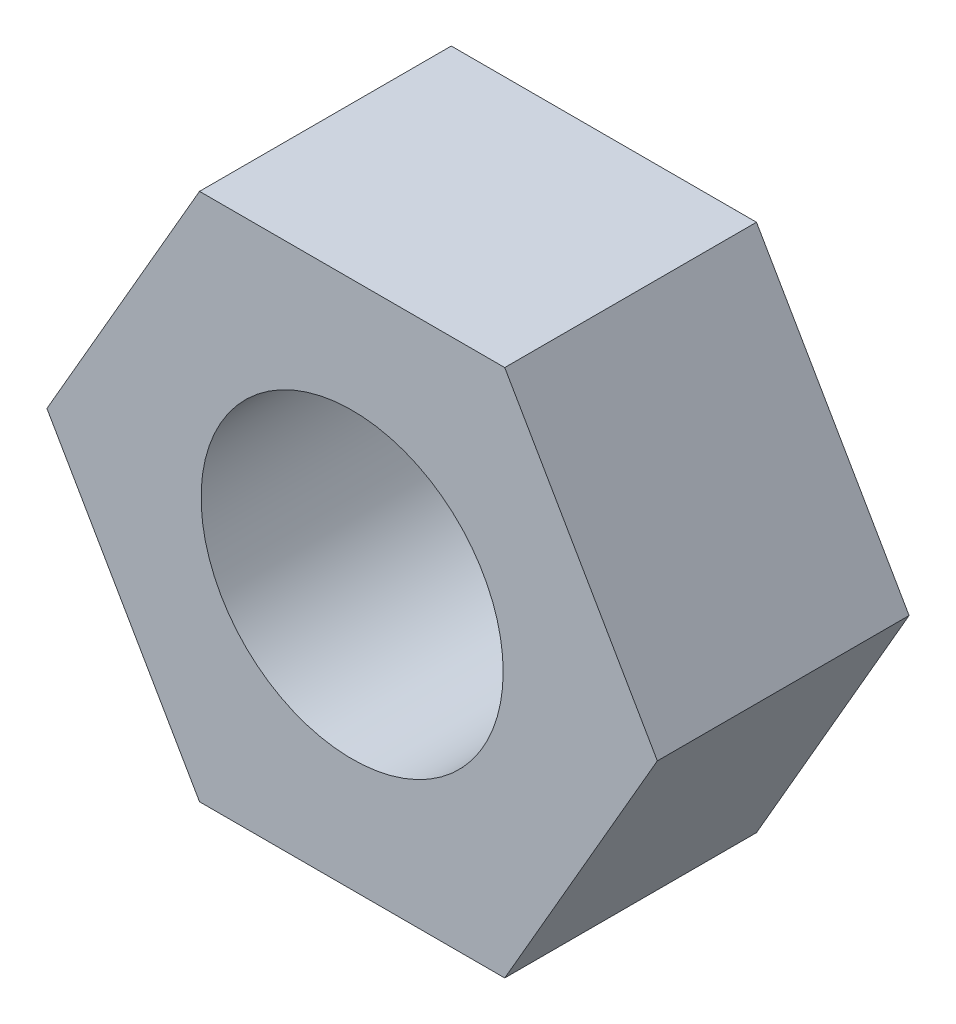
ISO-10303-21;
HEADER;
FILE_DESCRIPTION(('STEP AP214'),'2;1');
FILE_NAME('part.step','',(''),(''),'','','');
FILE_SCHEMA(('AUTOMOTIVE_DESIGN { 1 0 10303 214 1 1 1 1 }'));
ENDSEC;
DATA;
#1=APPLICATION_CONTEXT('core data for automotive mechanical design processes');
#2=APPLICATION_PROTOCOL_DEFINITION('international standard','automotive_design',2000,#1);
#3=PRODUCT_CONTEXT('',#1,'mechanical');
#4=PRODUCT('Part','Part','',(#3));
#5=PRODUCT_RELATED_PRODUCT_CATEGORY('part','',(#4));
#6=PRODUCT_DEFINITION_FORMATION('','',#4);
#7=PRODUCT_DEFINITION_CONTEXT('part definition',#1,'design');
#8=PRODUCT_DEFINITION('design','',#6,#7);
#9=PRODUCT_DEFINITION_SHAPE('','',#8);
#10=(LENGTH_UNIT() NAMED_UNIT(*) SI_UNIT(.MILLI.,.METRE.));
#11=(NAMED_UNIT(*) PLANE_ANGLE_UNIT() SI_UNIT($,.RADIAN.));
#12=(NAMED_UNIT(*) SI_UNIT($,.STERADIAN.) SOLID_ANGLE_UNIT());
#13=UNCERTAINTY_MEASURE_WITH_UNIT(LENGTH_MEASURE(1.E-05),#10,'distance_accuracy_value','');
#14=(GEOMETRIC_REPRESENTATION_CONTEXT(3) GLOBAL_UNCERTAINTY_ASSIGNED_CONTEXT((#13)) GLOBAL_UNIT_ASSIGNED_CONTEXT((#10,
#11,#12)) REPRESENTATION_CONTEXT('',''));
#15=CARTESIAN_POINT('',(0.,0.,0.));
#16=DIRECTION('',(0.,0.,1.));
#17=DIRECTION('',(1.,0.,0.));
#18=AXIS2_PLACEMENT_3D('',#15,#16,#17);
#19=CARTESIAN_POINT('',(0.,0.,5.));
#20=DIRECTION('',(0.,0.,1.));
#21=DIRECTION('',(1.,0.,0.));
#22=AXIS2_PLACEMENT_3D('',#19,#20,#21);
#23=PLANE('',#22);
#24=DIRECTION('',(0.5,0.866025403784439,0.));
#25=VECTOR('',#24,1.);
#26=CARTESIAN_POINT('',(3.03108891324554,-5.25000000000001,5.));
#27=LINE('',#26,#25);
#28=CARTESIAN_POINT('',(3.03108891324554,-5.25000000000001,5.));
#29=VERTEX_POINT('',#28);
#30=CARTESIAN_POINT('',(6.06217782649107,0.,5.));
#31=VERTEX_POINT('',#30);
#32=EDGE_CURVE('E128',#29,#31,#27,.T.);
#33=ORIENTED_EDGE('',*,*,#32,.T.);
#34=DIRECTION('',(-0.5,0.866025403784438,0.));
#35=VECTOR('',#34,1.);
#36=CARTESIAN_POINT('',(6.06217782649107,0.,5.));
#37=LINE('',#36,#35);
#38=CARTESIAN_POINT('',(3.03108891324553,5.25,5.));
#39=VERTEX_POINT('',#38);
#40=EDGE_CURVE('E86',#31,#39,#37,.T.);
#41=ORIENTED_EDGE('',*,*,#40,.T.);
#42=DIRECTION('',(-1.,0.,0.));
#43=VECTOR('',#42,1.);
#44=CARTESIAN_POINT('',(3.03108891324553,5.25,5.));
#45=LINE('',#44,#43);
#46=CARTESIAN_POINT('',(-3.03108891324553,5.25,5.));
#47=VERTEX_POINT('',#46);
#48=EDGE_CURVE('E99',#39,#47,#45,.T.);
#49=ORIENTED_EDGE('',*,*,#48,.T.);
#50=DIRECTION('',(-0.5,-0.866025403784439,0.));
#51=VECTOR('',#50,1.);
#52=CARTESIAN_POINT('',(-3.03108891324553,5.25,5.));
#53=LINE('',#52,#51);
#54=CARTESIAN_POINT('',(-6.06217782649107,0.,5.));
#55=VERTEX_POINT('',#54);
#56=EDGE_CURVE('E93',#47,#55,#53,.T.);
#57=ORIENTED_EDGE('',*,*,#56,.T.);
#58=DIRECTION('',(0.5,-0.866025403784439,0.));
#59=VECTOR('',#58,1.);
#60=CARTESIAN_POINT('',(-6.06217782649107,0.,5.));
#61=LINE('',#60,#59);
#62=CARTESIAN_POINT('',(-3.03108891324553,-5.25000000000001,5.));
#63=VERTEX_POINT('',#62);
#64=EDGE_CURVE('E97',#55,#63,#61,.T.);
#65=ORIENTED_EDGE('',*,*,#64,.T.);
#66=DIRECTION('',(1.,0.,0.));
#67=VECTOR('',#66,1.);
#68=CARTESIAN_POINT('',(-3.03108891324553,-5.25000000000001,5.));
#69=LINE('',#68,#67);
#70=EDGE_CURVE('E49',#63,#29,#69,.T.);
#71=ORIENTED_EDGE('',*,*,#70,.T.);
#72=EDGE_LOOP('',(#33,#41,#49,#57,#65,#71));
#73=FACE_BOUND('',#72,.T.);
#74=CARTESIAN_POINT('',(0.,0.,5.));
#75=DIRECTION('',(0.,0.,1.));
#76=DIRECTION('',(1.,0.,0.));
#77=AXIS2_PLACEMENT_3D('',#74,#75,#76);
#78=CIRCLE('',#77,3.);
#79=CARTESIAN_POINT('',(3.,0.,5.));
#80=VERTEX_POINT('',#79);
#81=EDGE_CURVE('E121',#80,#80,#78,.T.);
#82=ORIENTED_EDGE('',*,*,#81,.F.);
#83=EDGE_LOOP('',(#82));
#84=FACE_BOUND('',#83,.T.);
#85=ADVANCED_FACE('F32',(#73,#84),#23,.T.);
#86=CARTESIAN_POINT('',(0.,0.,0.));
#87=DIRECTION('',(0.,0.,1.));
#88=DIRECTION('',(1.,0.,0.));
#89=AXIS2_PLACEMENT_3D('',#86,#87,#88);
#90=PLANE('',#89);
#91=DIRECTION('',(0.5,0.866025403784439,0.));
#92=VECTOR('',#91,1.);
#93=CARTESIAN_POINT('',(3.03108891324554,-5.25000000000001,0.));
#94=LINE('',#93,#92);
#95=CARTESIAN_POINT('',(3.03108891324554,-5.25000000000001,0.));
#96=VERTEX_POINT('',#95);
#97=CARTESIAN_POINT('',(6.06217782649107,0.,0.));
#98=VERTEX_POINT('',#97);
#99=EDGE_CURVE('E117',#96,#98,#94,.T.);
#100=ORIENTED_EDGE('',*,*,#99,.F.);
#101=DIRECTION('',(1.,0.,0.));
#102=VECTOR('',#101,1.);
#103=CARTESIAN_POINT('',(-3.03108891324553,-5.25000000000001,0.));
#104=LINE('',#103,#102);
#105=CARTESIAN_POINT('',(-3.03108891324553,-5.25000000000001,0.));
#106=VERTEX_POINT('',#105);
#107=EDGE_CURVE('E78',#106,#96,#104,.T.);
#108=ORIENTED_EDGE('',*,*,#107,.F.);
#109=DIRECTION('',(0.5,-0.866025403784439,0.));
#110=VECTOR('',#109,1.);
#111=CARTESIAN_POINT('',(-6.06217782649107,0.,0.));
#112=LINE('',#111,#110);
#113=CARTESIAN_POINT('',(-6.06217782649107,0.,0.));
#114=VERTEX_POINT('',#113);
#115=EDGE_CURVE('E72',#114,#106,#112,.T.);
#116=ORIENTED_EDGE('',*,*,#115,.F.);
#117=DIRECTION('',(-0.5,-0.866025403784439,0.));
#118=VECTOR('',#117,1.);
#119=CARTESIAN_POINT('',(-3.03108891324553,5.25,0.));
#120=LINE('',#119,#118);
#121=CARTESIAN_POINT('',(-3.03108891324553,5.25,0.));
#122=VERTEX_POINT('',#121);
#123=EDGE_CURVE('E107',#122,#114,#120,.T.);
#124=ORIENTED_EDGE('',*,*,#123,.F.);
#125=DIRECTION('',(-1.,0.,0.));
#126=VECTOR('',#125,1.);
#127=CARTESIAN_POINT('',(3.03108891324553,5.25,0.));
#128=LINE('',#127,#126);
#129=CARTESIAN_POINT('',(3.03108891324553,5.25,0.));
#130=VERTEX_POINT('',#129);
#131=EDGE_CURVE('E123',#130,#122,#128,.T.);
#132=ORIENTED_EDGE('',*,*,#131,.F.);
#133=DIRECTION('',(-0.5,0.866025403784438,0.));
#134=VECTOR('',#133,1.);
#135=CARTESIAN_POINT('',(6.06217782649107,0.,0.));
#136=LINE('',#135,#134);
#137=EDGE_CURVE('E120',#98,#130,#136,.T.);
#138=ORIENTED_EDGE('',*,*,#137,.F.);
#139=EDGE_LOOP('',(#100,#108,#116,#124,#132,#138));
#140=FACE_BOUND('',#139,.T.);
#141=CARTESIAN_POINT('',(0.,0.,0.));
#142=DIRECTION('',(0.,0.,1.));
#143=DIRECTION('',(1.,0.,0.));
#144=AXIS2_PLACEMENT_3D('',#141,#142,#143);
#145=CIRCLE('',#144,3.);
#146=CARTESIAN_POINT('',(3.,0.,0.));
#147=VERTEX_POINT('',#146);
#148=EDGE_CURVE('E221',#147,#147,#145,.T.);
#149=ORIENTED_EDGE('',*,*,#148,.T.);
#150=EDGE_LOOP('',(#149));
#151=FACE_BOUND('',#150,.T.);
#152=ADVANCED_FACE('F137',(#140,#151),#90,.F.);
#153=CARTESIAN_POINT('',(3.03108891324554,-5.25000000000001,5.));
#154=DIRECTION('',(-0.866025403784439,0.5,0.));
#155=DIRECTION('',(-0.5,-0.866025403784439,0.));
#156=AXIS2_PLACEMENT_3D('',#153,#154,#155);
#157=PLANE('',#156);
#158=ORIENTED_EDGE('',*,*,#99,.T.);
#159=DIRECTION('',(0.,0.,-1.));
#160=VECTOR('',#159,1.);
#161=CARTESIAN_POINT('',(6.06217782649107,0.,5.));
#162=LINE('',#161,#160);
#163=EDGE_CURVE('E11',#31,#98,#162,.T.);
#164=ORIENTED_EDGE('',*,*,#163,.F.);
#165=ORIENTED_EDGE('',*,*,#32,.F.);
#166=DIRECTION('',(0.,0.,-1.));
#167=VECTOR('',#166,1.);
#168=CARTESIAN_POINT('',(3.03108891324554,-5.25000000000001,5.));
#169=LINE('',#168,#167);
#170=EDGE_CURVE('E113',#29,#96,#169,.T.);
#171=ORIENTED_EDGE('',*,*,#170,.T.);
#172=EDGE_LOOP('',(#158,#164,#165,#171));
#173=FACE_BOUND('',#172,.T.);
#174=ADVANCED_FACE('F34',(#173),#157,.F.);
#175=CARTESIAN_POINT('',(6.06217782649107,0.,5.));
#176=DIRECTION('',(-0.866025403784438,-0.5,0.));
#177=DIRECTION('',(0.5,-0.866025403784439,0.));
#178=AXIS2_PLACEMENT_3D('',#175,#176,#177);
#179=PLANE('',#178);
#180=ORIENTED_EDGE('',*,*,#137,.T.);
#181=DIRECTION('',(0.,0.,-1.));
#182=VECTOR('',#181,1.);
#183=CARTESIAN_POINT('',(3.03108891324553,5.25,5.));
#184=LINE('',#183,#182);
#185=EDGE_CURVE('E41',#39,#130,#184,.T.);
#186=ORIENTED_EDGE('',*,*,#185,.F.);
#187=ORIENTED_EDGE('',*,*,#40,.F.);
#188=ORIENTED_EDGE('',*,*,#163,.T.);
#189=EDGE_LOOP('',(#180,#186,#187,#188));
#190=FACE_BOUND('',#189,.T.);
#191=ADVANCED_FACE('F162',(#190),#179,.F.);
#192=CARTESIAN_POINT('',(3.03108891324553,5.25,5.));
#193=DIRECTION('',(0.,-1.,0.));
#194=DIRECTION('',(0.,0.,-1.));
#195=AXIS2_PLACEMENT_3D('',#192,#193,#194);
#196=PLANE('',#195);
#197=ORIENTED_EDGE('',*,*,#131,.T.);
#198=DIRECTION('',(0.,0.,-1.));
#199=VECTOR('',#198,1.);
#200=CARTESIAN_POINT('',(-3.03108891324553,5.25,5.));
#201=LINE('',#200,#199);
#202=EDGE_CURVE('E108',#47,#122,#201,.T.);
#203=ORIENTED_EDGE('',*,*,#202,.F.);
#204=ORIENTED_EDGE('',*,*,#48,.F.);
#205=ORIENTED_EDGE('',*,*,#185,.T.);
#206=EDGE_LOOP('',(#197,#203,#204,#205));
#207=FACE_BOUND('',#206,.T.);
#208=ADVANCED_FACE('F134',(#207),#196,.F.);
#209=CARTESIAN_POINT('',(-3.03108891324553,5.25,5.));
#210=DIRECTION('',(0.866025403784439,-0.5,0.));
#211=DIRECTION('',(0.5,0.866025403784439,0.));
#212=AXIS2_PLACEMENT_3D('',#209,#210,#211);
#213=PLANE('',#212);
#214=ORIENTED_EDGE('',*,*,#123,.T.);
#215=DIRECTION('',(0.,0.,-1.));
#216=VECTOR('',#215,1.);
#217=CARTESIAN_POINT('',(-6.06217782649107,0.,5.));
#218=LINE('',#217,#216);
#219=EDGE_CURVE('E104',#55,#114,#218,.T.);
#220=ORIENTED_EDGE('',*,*,#219,.F.);
#221=ORIENTED_EDGE('',*,*,#56,.F.);
#222=ORIENTED_EDGE('',*,*,#202,.T.);
#223=EDGE_LOOP('',(#214,#220,#221,#222));
#224=FACE_BOUND('',#223,.T.);
#225=ADVANCED_FACE('F105',(#224),#213,.F.);
#226=CARTESIAN_POINT('',(-6.06217782649107,0.,5.));
#227=DIRECTION('',(0.866025403784439,0.5,0.));
#228=DIRECTION('',(-0.5,0.866025403784439,0.));
#229=AXIS2_PLACEMENT_3D('',#226,#227,#228);
#230=PLANE('',#229);
#231=ORIENTED_EDGE('',*,*,#115,.T.);
#232=DIRECTION('',(0.,0.,-1.));
#233=VECTOR('',#232,1.);
#234=CARTESIAN_POINT('',(-3.03108891324553,-5.25000000000001,5.));
#235=LINE('',#234,#233);
#236=EDGE_CURVE('E109',#63,#106,#235,.T.);
#237=ORIENTED_EDGE('',*,*,#236,.F.);
#238=ORIENTED_EDGE('',*,*,#64,.F.);
#239=ORIENTED_EDGE('',*,*,#219,.T.);
#240=EDGE_LOOP('',(#231,#237,#238,#239));
#241=FACE_BOUND('',#240,.T.);
#242=ADVANCED_FACE('F111',(#241),#230,.F.);
#243=CARTESIAN_POINT('',(-3.03108891324553,-5.25000000000001,5.));
#244=DIRECTION('',(0.,1.,0.));
#245=DIRECTION('',(0.,0.,1.));
#246=AXIS2_PLACEMENT_3D('',#243,#244,#245);
#247=PLANE('',#246);
#248=ORIENTED_EDGE('',*,*,#107,.T.);
#249=ORIENTED_EDGE('',*,*,#170,.F.);
#250=ORIENTED_EDGE('',*,*,#70,.F.);
#251=ORIENTED_EDGE('',*,*,#236,.T.);
#252=EDGE_LOOP('',(#248,#249,#250,#251));
#253=FACE_BOUND('',#252,.T.);
#254=ADVANCED_FACE('F142',(#253),#247,.F.);
#255=CARTESIAN_POINT('',(0.,0.,5.));
#256=DIRECTION('',(0.,0.,-1.));
#257=DIRECTION('',(-1.,0.,0.));
#258=AXIS2_PLACEMENT_3D('',#255,#256,#257);
#259=CYLINDRICAL_SURFACE('',#258,3.);
#260=ORIENTED_EDGE('',*,*,#81,.T.);
#261=EDGE_LOOP('',(#260));
#262=FACE_BOUND('',#261,.T.);
#263=ORIENTED_EDGE('',*,*,#148,.F.);
#264=EDGE_LOOP('',(#263));
#265=FACE_BOUND('',#264,.T.);
#266=ADVANCED_FACE('F144',(#262,#265),#259,.F.);
#267=CLOSED_SHELL('',(#85,#152,#174,#191,#208,#225,#242,#254,#266));
#268=MANIFOLD_SOLID_BREP('B2',#267);
#269=ADVANCED_BREP_SHAPE_REPRESENTATION('',(#18,#268),#14);
#270=SHAPE_DEFINITION_REPRESENTATION(#9,#269);
ENDSEC;
END-ISO-10303-21;
